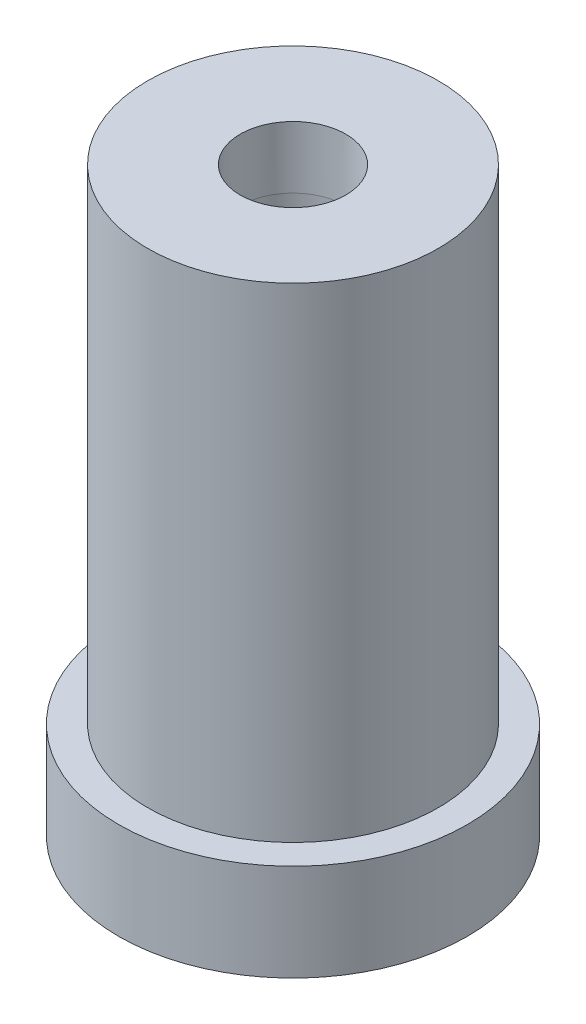
ISO-10303-21;
HEADER;
FILE_DESCRIPTION(('STEP AP214'),'2;1');
FILE_NAME('part.step','',(''),(''),'','','');
FILE_SCHEMA(('AUTOMOTIVE_DESIGN { 1 0 10303 214 1 1 1 1 }'));
ENDSEC;
DATA;
#1=APPLICATION_CONTEXT('core data for automotive mechanical design processes');
#2=APPLICATION_PROTOCOL_DEFINITION('international standard','automotive_design',2000,#1);
#3=PRODUCT_CONTEXT('',#1,'mechanical');
#4=PRODUCT('Part','Part','',(#3));
#5=PRODUCT_RELATED_PRODUCT_CATEGORY('part','',(#4));
#6=PRODUCT_DEFINITION_FORMATION('','',#4);
#7=PRODUCT_DEFINITION_CONTEXT('part definition',#1,'design');
#8=PRODUCT_DEFINITION('design','',#6,#7);
#9=PRODUCT_DEFINITION_SHAPE('','',#8);
#10=(LENGTH_UNIT() NAMED_UNIT(*) SI_UNIT(.MILLI.,.METRE.));
#11=(NAMED_UNIT(*) PLANE_ANGLE_UNIT() SI_UNIT($,.RADIAN.));
#12=(NAMED_UNIT(*) SI_UNIT($,.STERADIAN.) SOLID_ANGLE_UNIT());
#13=UNCERTAINTY_MEASURE_WITH_UNIT(LENGTH_MEASURE(1.E-05),#10,'distance_accuracy_value','');
#14=(GEOMETRIC_REPRESENTATION_CONTEXT(3) GLOBAL_UNCERTAINTY_ASSIGNED_CONTEXT((#13)) GLOBAL_UNIT_ASSIGNED_CONTEXT((#10,
#11,#12)) REPRESENTATION_CONTEXT('',''));
#15=CARTESIAN_POINT('',(0.,0.,0.));
#16=DIRECTION('',(0.,0.,1.));
#17=DIRECTION('',(1.,0.,0.));
#18=AXIS2_PLACEMENT_3D('',#15,#16,#17);
#19=CARTESIAN_POINT('',(0.,0.,0.));
#20=DIRECTION('',(0.,1.,0.));
#21=DIRECTION('',(-1.,0.,0.));
#22=AXIS2_PLACEMENT_3D('',#19,#20,#21);
#23=PLANE('',#22);
#24=CARTESIAN_POINT('',(0.,0.,0.));
#25=DIRECTION('',(0.,-1.,0.));
#26=DIRECTION('',(0.,0.,1.));
#27=AXIS2_PLACEMENT_3D('',#24,#25,#26);
#28=CIRCLE('',#27,3.42678269805402);
#29=CARTESIAN_POINT('',(0.,0.,3.42678269805402));
#30=VERTEX_POINT('',#29);
#31=CARTESIAN_POINT('',(3.42678269805402,0.,0.));
#32=VERTEX_POINT('',#31);
#33=EDGE_CURVE('E67',#30,#32,#28,.T.);
#34=ORIENTED_EDGE('',*,*,#33,.F.);
#35=CARTESIAN_POINT('',(0.,0.,0.));
#36=DIRECTION('',(0.,-1.,0.));
#37=DIRECTION('',(1.,0.,0.));
#38=AXIS2_PLACEMENT_3D('',#35,#36,#37);
#39=CIRCLE('',#38,3.42678269805402);
#40=EDGE_CURVE('E54',#32,#30,#39,.T.);
#41=ORIENTED_EDGE('',*,*,#40,.F.);
#42=EDGE_LOOP('',(#34,#41));
#43=FACE_BOUND('',#42,.T.);
#44=CARTESIAN_POINT('',(0.,0.,0.));
#45=DIRECTION('',(0.,1.,0.));
#46=DIRECTION('',(-1.,0.,0.));
#47=AXIS2_PLACEMENT_3D('',#44,#45,#46);
#48=CIRCLE('',#47,9.00000000000001);
#49=CARTESIAN_POINT('',(-9.00000000000001,0.,0.));
#50=VERTEX_POINT('',#49);
#51=EDGE_CURVE('E11',#50,#50,#48,.T.);
#52=ORIENTED_EDGE('',*,*,#51,.F.);
#53=EDGE_LOOP('',(#52));
#54=FACE_BOUND('',#53,.T.);
#55=ADVANCED_FACE('F40',(#43,#54),#23,.F.);
#56=CARTESIAN_POINT('',(0.,35.,0.));
#57=DIRECTION('',(0.,1.,0.));
#58=DIRECTION('',(-1.,0.,0.));
#59=AXIS2_PLACEMENT_3D('',#56,#57,#58);
#60=CYLINDRICAL_SURFACE('',#59,9.00000000000001);
#61=CARTESIAN_POINT('',(0.,5.,0.));
#62=DIRECTION('',(0.,1.,0.));
#63=DIRECTION('',(-1.,0.,0.));
#64=AXIS2_PLACEMENT_3D('',#61,#62,#63);
#65=CIRCLE('',#64,9.00000000000001);
#66=CARTESIAN_POINT('',(-9.00000000000001,5.,0.));
#67=VERTEX_POINT('',#66);
#68=EDGE_CURVE('E47',#67,#67,#65,.T.);
#69=ORIENTED_EDGE('',*,*,#68,.F.);
#70=EDGE_LOOP('',(#69));
#71=FACE_BOUND('',#70,.T.);
#72=ORIENTED_EDGE('',*,*,#51,.T.);
#73=EDGE_LOOP('',(#72));
#74=FACE_BOUND('',#73,.T.);
#75=ADVANCED_FACE('F97',(#71,#74),#60,.T.);
#76=CARTESIAN_POINT('',(9.00000000000001,5.,0.));
#77=DIRECTION('',(0.,-1.,0.));
#78=DIRECTION('',(1.,0.,0.));
#79=AXIS2_PLACEMENT_3D('',#76,#77,#78);
#80=PLANE('',#79);
#81=CARTESIAN_POINT('',(0.,5.,0.));
#82=DIRECTION('',(0.,1.,0.));
#83=DIRECTION('',(-1.,0.,0.));
#84=AXIS2_PLACEMENT_3D('',#81,#82,#83);
#85=CIRCLE('',#84,7.5);
#86=CARTESIAN_POINT('',(-7.5,5.,0.));
#87=VERTEX_POINT('',#86);
#88=EDGE_CURVE('E90',#87,#87,#85,.T.);
#89=ORIENTED_EDGE('',*,*,#88,.F.);
#90=EDGE_LOOP('',(#89));
#91=FACE_BOUND('',#90,.T.);
#92=ORIENTED_EDGE('',*,*,#68,.T.);
#93=EDGE_LOOP('',(#92));
#94=FACE_BOUND('',#93,.T.);
#95=ADVANCED_FACE('F95',(#91,#94),#80,.F.);
#96=CARTESIAN_POINT('',(0.,35.,0.));
#97=DIRECTION('',(0.,1.,0.));
#98=DIRECTION('',(-1.,0.,0.));
#99=AXIS2_PLACEMENT_3D('',#96,#97,#98);
#100=CYLINDRICAL_SURFACE('',#99,7.5);
#101=CARTESIAN_POINT('',(0.,30.,0.));
#102=DIRECTION('',(0.,1.,0.));
#103=DIRECTION('',(-1.,0.,0.));
#104=AXIS2_PLACEMENT_3D('',#101,#102,#103);
#105=CIRCLE('',#104,7.5);
#106=CARTESIAN_POINT('',(-7.5,30.,0.));
#107=VERTEX_POINT('',#106);
#108=EDGE_CURVE('E87',#107,#107,#105,.T.);
#109=ORIENTED_EDGE('',*,*,#108,.F.);
#110=EDGE_LOOP('',(#109));
#111=FACE_BOUND('',#110,.T.);
#112=ORIENTED_EDGE('',*,*,#88,.T.);
#113=EDGE_LOOP('',(#112));
#114=FACE_BOUND('',#113,.T.);
#115=ADVANCED_FACE('F142',(#111,#114),#100,.T.);
#116=CARTESIAN_POINT('',(7.50000000000001,30.,0.));
#117=DIRECTION('',(0.,-1.,0.));
#118=DIRECTION('',(1.,0.,0.));
#119=AXIS2_PLACEMENT_3D('',#116,#117,#118);
#120=PLANE('',#119);
#121=CARTESIAN_POINT('',(0.,30.,0.));
#122=DIRECTION('',(0.,1.,0.));
#123=DIRECTION('',(0.,0.,1.));
#124=AXIS2_PLACEMENT_3D('',#121,#122,#123);
#125=CIRCLE('',#124,2.725);
#126=CARTESIAN_POINT('',(0.,30.,2.725));
#127=VERTEX_POINT('',#126);
#128=EDGE_CURVE('E83',#127,#127,#125,.T.);
#129=ORIENTED_EDGE('',*,*,#128,.F.);
#130=EDGE_LOOP('',(#129));
#131=FACE_BOUND('',#130,.T.);
#132=ORIENTED_EDGE('',*,*,#108,.T.);
#133=EDGE_LOOP('',(#132));
#134=FACE_BOUND('',#133,.T.);
#135=ADVANCED_FACE('F110',(#131,#134),#120,.F.);
#136=CARTESIAN_POINT('',(0.,-0.001000000000001,0.));
#137=DIRECTION('',(0.,1.,0.));
#138=DIRECTION('',(0.,0.,1.));
#139=AXIS2_PLACEMENT_3D('',#136,#137,#138);
#140=CYLINDRICAL_SURFACE('',#139,2.725);
#141=CARTESIAN_POINT('',(0.,26.8,0.));
#142=DIRECTION('',(0.,-1.,0.));
#143=DIRECTION('',(1.,0.,0.));
#144=AXIS2_PLACEMENT_3D('',#141,#142,#143);
#145=CIRCLE('',#144,2.725);
#146=CARTESIAN_POINT('',(2.725,26.8,0.));
#147=VERTEX_POINT('',#146);
#148=CARTESIAN_POINT('',(0.,26.8,2.725));
#149=VERTEX_POINT('',#148);
#150=EDGE_CURVE('E73',#147,#149,#145,.T.);
#151=ORIENTED_EDGE('',*,*,#150,.T.);
#152=CARTESIAN_POINT('',(0.,26.8,0.));
#153=DIRECTION('',(0.,-1.,0.));
#154=DIRECTION('',(0.,0.,1.));
#155=AXIS2_PLACEMENT_3D('',#152,#153,#154);
#156=CIRCLE('',#155,2.725);
#157=EDGE_CURVE('E72',#149,#147,#156,.T.);
#158=ORIENTED_EDGE('',*,*,#157,.T.);
#159=EDGE_LOOP('',(#151,#158));
#160=FACE_BOUND('',#159,.T.);
#161=ORIENTED_EDGE('',*,*,#128,.T.);
#162=EDGE_LOOP('',(#161));
#163=FACE_BOUND('',#162,.T.);
#164=ADVANCED_FACE('F114',(#160,#163),#140,.F.);
#165=CARTESIAN_POINT('',(0.,0.,0.));
#166=DIRECTION('',(0.,-1.,0.));
#167=DIRECTION('',(0.,0.,-1.));
#168=AXIS2_PLACEMENT_3D('',#165,#166,#167);
#169=CONICAL_SURFACE('',#168,3.42678269805402,0.0261799387799079);
#170=ORIENTED_EDGE('',*,*,#150,.F.);
#171=DIRECTION('',(-0.0261769483078661,0.999657324975558,0.));
#172=VECTOR('',#171,1.);
#173=CARTESIAN_POINT('',(2.725,26.8,0.));
#174=LINE('',#173,#172);
#175=EDGE_CURVE('E69',#32,#147,#174,.T.);
#176=ORIENTED_EDGE('',*,*,#175,.F.);
#177=ORIENTED_EDGE('',*,*,#40,.T.);
#178=DIRECTION('',(0.,0.999657324975558,-0.0261769483078661));
#179=VECTOR('',#178,1.);
#180=CARTESIAN_POINT('',(0.,26.8,2.725));
#181=LINE('',#180,#179);
#182=EDGE_CURVE('E58',#30,#149,#181,.T.);
#183=ORIENTED_EDGE('',*,*,#182,.T.);
#184=EDGE_LOOP('',(#170,#176,#177,#183));
#185=FACE_BOUND('',#184,.T.);
#186=ADVANCED_FACE('F75',(#185),#169,.F.);
#187=CARTESIAN_POINT('',(0.,0.,0.));
#188=DIRECTION('',(0.,-1.,0.));
#189=DIRECTION('',(0.,0.,-1.));
#190=AXIS2_PLACEMENT_3D('',#187,#188,#189);
#191=CONICAL_SURFACE('',#190,3.42678269805402,0.0261799387799079);
#192=ORIENTED_EDGE('',*,*,#175,.T.);
#193=ORIENTED_EDGE('',*,*,#157,.F.);
#194=ORIENTED_EDGE('',*,*,#182,.F.);
#195=ORIENTED_EDGE('',*,*,#33,.T.);
#196=EDGE_LOOP('',(#192,#193,#194,#195));
#197=FACE_BOUND('',#196,.T.);
#198=ADVANCED_FACE('F68',(#197),#191,.F.);
#199=CLOSED_SHELL('',(#55,#75,#95,#115,#135,#164,#186,#198));
#200=MANIFOLD_SOLID_BREP('B2',#199);
#201=ADVANCED_BREP_SHAPE_REPRESENTATION('',(#18,#200),#14);
#202=SHAPE_DEFINITION_REPRESENTATION(#9,#201);
ENDSEC;
END-ISO-10303-21;
